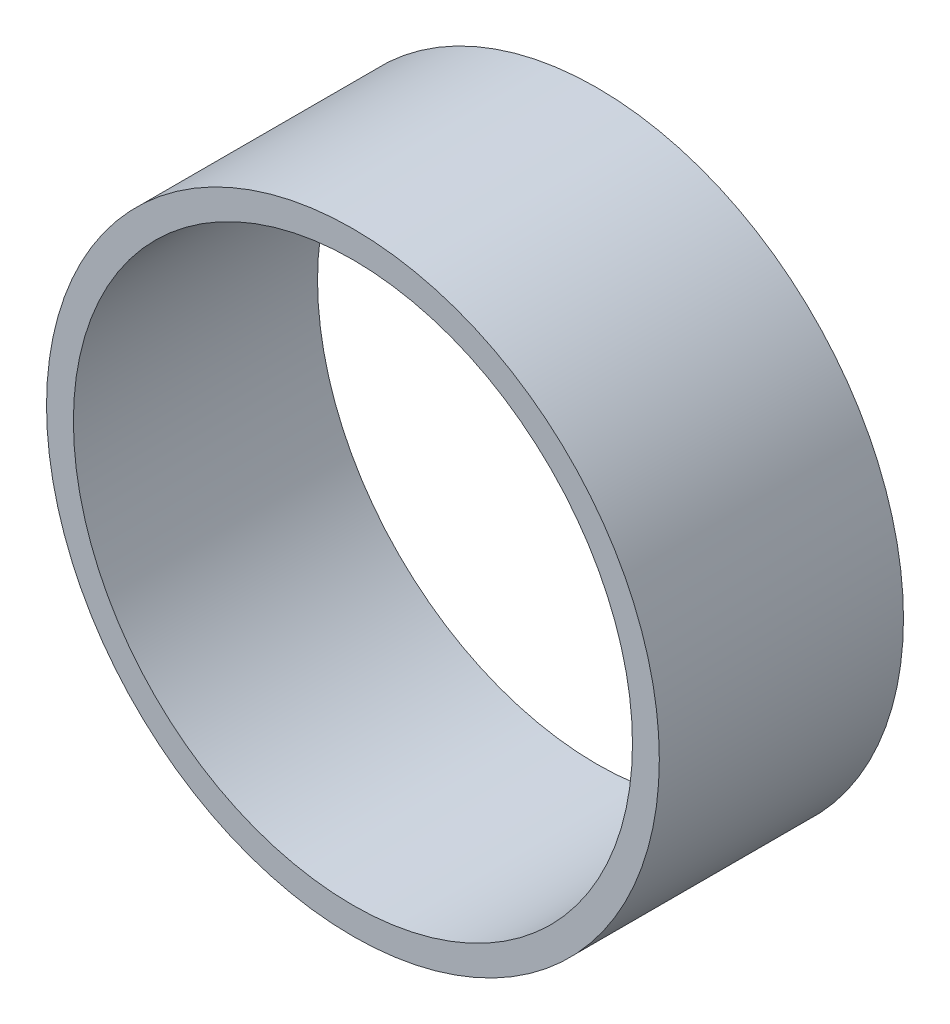
ISO-10303-21;
HEADER;
FILE_DESCRIPTION(('STEP AP214'),'2;1');
FILE_NAME('part.step','',(''),(''),'','','');
FILE_SCHEMA(('AUTOMOTIVE_DESIGN { 1 0 10303 214 1 1 1 1 }'));
ENDSEC;
DATA;
#1=APPLICATION_CONTEXT('core data for automotive mechanical design processes');
#2=APPLICATION_PROTOCOL_DEFINITION('international standard','automotive_design',2000,#1);
#3=PRODUCT_CONTEXT('',#1,'mechanical');
#4=PRODUCT('Part','Part','',(#3));
#5=PRODUCT_RELATED_PRODUCT_CATEGORY('part','',(#4));
#6=PRODUCT_DEFINITION_FORMATION('','',#4);
#7=PRODUCT_DEFINITION_CONTEXT('part definition',#1,'design');
#8=PRODUCT_DEFINITION('design','',#6,#7);
#9=PRODUCT_DEFINITION_SHAPE('','',#8);
#10=(LENGTH_UNIT() NAMED_UNIT(*) SI_UNIT(.MILLI.,.METRE.));
#11=(NAMED_UNIT(*) PLANE_ANGLE_UNIT() SI_UNIT($,.RADIAN.));
#12=(NAMED_UNIT(*) SI_UNIT($,.STERADIAN.) SOLID_ANGLE_UNIT());
#13=UNCERTAINTY_MEASURE_WITH_UNIT(LENGTH_MEASURE(1.E-05),#10,'distance_accuracy_value','');
#14=(GEOMETRIC_REPRESENTATION_CONTEXT(3) GLOBAL_UNCERTAINTY_ASSIGNED_CONTEXT((#13)) GLOBAL_UNIT_ASSIGNED_CONTEXT((#10,
#11,#12)) REPRESENTATION_CONTEXT('',''));
#15=CARTESIAN_POINT('',(0.,0.,0.));
#16=DIRECTION('',(0.,0.,1.));
#17=DIRECTION('',(1.,0.,0.));
#18=AXIS2_PLACEMENT_3D('',#15,#16,#17);
#19=CARTESIAN_POINT('',(0.,0.,6.35));
#20=DIRECTION('',(0.,0.,1.));
#21=DIRECTION('',(1.,0.,0.));
#22=AXIS2_PLACEMENT_3D('',#19,#20,#21);
#23=PLANE('',#22);
#24=CARTESIAN_POINT('',(0.,0.,6.35));
#25=DIRECTION('',(0.,0.,1.));
#26=DIRECTION('',(1.,0.,0.));
#27=AXIS2_PLACEMENT_3D('',#24,#25,#26);
#28=CIRCLE('',#27,15.9385);
#29=CARTESIAN_POINT('',(15.9385,0.,6.35));
#30=VERTEX_POINT('',#29);
#31=EDGE_CURVE('E10',#30,#30,#28,.T.);
#32=ORIENTED_EDGE('',*,*,#31,.T.);
#33=EDGE_LOOP('',(#32));
#34=FACE_BOUND('',#33,.T.);
#35=CARTESIAN_POINT('',(0.,0.,6.35));
#36=DIRECTION('',(0.,0.,1.));
#37=DIRECTION('',(1.,0.,0.));
#38=AXIS2_PLACEMENT_3D('',#35,#36,#37);
#39=CIRCLE('',#38,14.5415);
#40=CARTESIAN_POINT('',(14.5415,0.,6.35));
#41=VERTEX_POINT('',#40);
#42=EDGE_CURVE('E54',#41,#41,#39,.T.);
#43=ORIENTED_EDGE('',*,*,#42,.F.);
#44=EDGE_LOOP('',(#43));
#45=FACE_BOUND('',#44,.T.);
#46=ADVANCED_FACE('F41',(#34,#45),#23,.T.);
#47=CARTESIAN_POINT('',(0.,0.,-6.35));
#48=DIRECTION('',(0.,0.,1.));
#49=DIRECTION('',(1.,0.,0.));
#50=AXIS2_PLACEMENT_3D('',#47,#48,#49);
#51=PLANE('',#50);
#52=CARTESIAN_POINT('',(0.,0.,-6.35));
#53=DIRECTION('',(0.,0.,1.));
#54=DIRECTION('',(1.,0.,0.));
#55=AXIS2_PLACEMENT_3D('',#52,#53,#54);
#56=CIRCLE('',#55,15.9385);
#57=CARTESIAN_POINT('',(15.9385,0.,-6.35));
#58=VERTEX_POINT('',#57);
#59=EDGE_CURVE('E45',#58,#58,#56,.T.);
#60=ORIENTED_EDGE('',*,*,#59,.F.);
#61=EDGE_LOOP('',(#60));
#62=FACE_BOUND('',#61,.T.);
#63=CARTESIAN_POINT('',(0.,0.,-6.35));
#64=DIRECTION('',(0.,0.,1.));
#65=DIRECTION('',(1.,0.,0.));
#66=AXIS2_PLACEMENT_3D('',#63,#64,#65);
#67=CIRCLE('',#66,14.5415);
#68=CARTESIAN_POINT('',(14.5415,0.,-6.35));
#69=VERTEX_POINT('',#68);
#70=EDGE_CURVE('E56',#69,#69,#67,.T.);
#71=ORIENTED_EDGE('',*,*,#70,.T.);
#72=EDGE_LOOP('',(#71));
#73=FACE_BOUND('',#72,.T.);
#74=ADVANCED_FACE('F68',(#62,#73),#51,.F.);
#75=CARTESIAN_POINT('',(0.,0.,6.35));
#76=DIRECTION('',(0.,0.,-1.));
#77=DIRECTION('',(-1.,0.,0.));
#78=AXIS2_PLACEMENT_3D('',#75,#76,#77);
#79=CYLINDRICAL_SURFACE('',#78,15.9385);
#80=ORIENTED_EDGE('',*,*,#31,.F.);
#81=EDGE_LOOP('',(#80));
#82=FACE_BOUND('',#81,.T.);
#83=ORIENTED_EDGE('',*,*,#59,.T.);
#84=EDGE_LOOP('',(#83));
#85=FACE_BOUND('',#84,.T.);
#86=ADVANCED_FACE('F43',(#82,#85),#79,.T.);
#87=CARTESIAN_POINT('',(0.,0.,6.35));
#88=DIRECTION('',(0.,0.,-1.));
#89=DIRECTION('',(-1.,0.,0.));
#90=AXIS2_PLACEMENT_3D('',#87,#88,#89);
#91=CYLINDRICAL_SURFACE('',#90,14.5415);
#92=ORIENTED_EDGE('',*,*,#42,.T.);
#93=EDGE_LOOP('',(#92));
#94=FACE_BOUND('',#93,.T.);
#95=ORIENTED_EDGE('',*,*,#70,.F.);
#96=EDGE_LOOP('',(#95));
#97=FACE_BOUND('',#96,.T.);
#98=ADVANCED_FACE('F64',(#94,#97),#91,.F.);
#99=CLOSED_SHELL('',(#46,#74,#86,#98));
#100=MANIFOLD_SOLID_BREP('B2',#99);
#101=ADVANCED_BREP_SHAPE_REPRESENTATION('',(#18,#100),#14);
#102=SHAPE_DEFINITION_REPRESENTATION(#9,#101);
ENDSEC;
END-ISO-10303-21;
